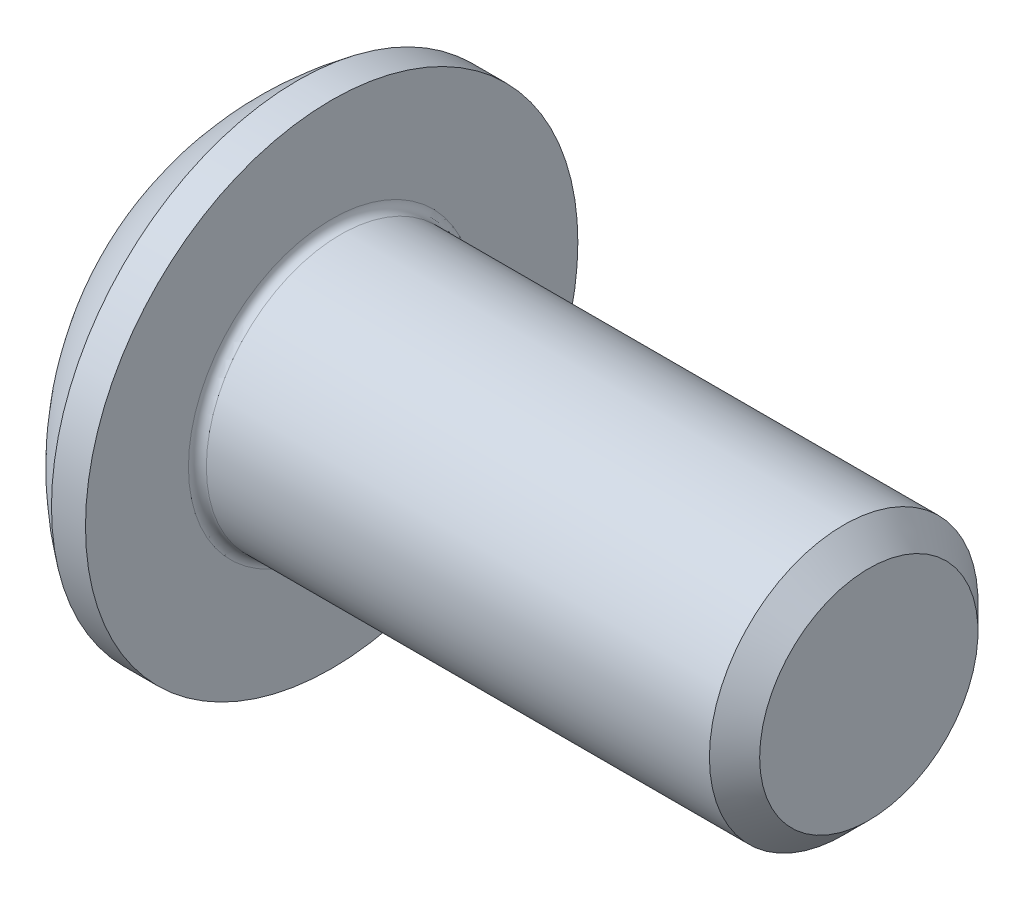
ISO-10303-21;
HEADER;
FILE_DESCRIPTION(('STEP AP214'),'2;1');
FILE_NAME('part.step','',(''),(''),'','','');
FILE_SCHEMA(('AUTOMOTIVE_DESIGN { 1 0 10303 214 1 1 1 1 }'));
ENDSEC;
DATA;
#1=APPLICATION_CONTEXT('core data for automotive mechanical design processes');
#2=APPLICATION_PROTOCOL_DEFINITION('international standard','automotive_design',2000,#1);
#3=PRODUCT_CONTEXT('',#1,'mechanical');
#4=PRODUCT('Part','Part','',(#3));
#5=PRODUCT_RELATED_PRODUCT_CATEGORY('part','',(#4));
#6=PRODUCT_DEFINITION_FORMATION('','',#4);
#7=PRODUCT_DEFINITION_CONTEXT('part definition',#1,'design');
#8=PRODUCT_DEFINITION('design','',#6,#7);
#9=PRODUCT_DEFINITION_SHAPE('','',#8);
#10=(LENGTH_UNIT() NAMED_UNIT(*) SI_UNIT(.MILLI.,.METRE.));
#11=(NAMED_UNIT(*) PLANE_ANGLE_UNIT() SI_UNIT($,.RADIAN.));
#12=(NAMED_UNIT(*) SI_UNIT($,.STERADIAN.) SOLID_ANGLE_UNIT());
#13=UNCERTAINTY_MEASURE_WITH_UNIT(LENGTH_MEASURE(1.E-05),#10,'distance_accuracy_value','');
#14=(GEOMETRIC_REPRESENTATION_CONTEXT(3) GLOBAL_UNCERTAINTY_ASSIGNED_CONTEXT((#13)) GLOBAL_UNIT_ASSIGNED_CONTEXT((#10,
#11,#12)) REPRESENTATION_CONTEXT('',''));
#15=CARTESIAN_POINT('',(0.,0.,0.));
#16=DIRECTION('',(0.,0.,1.));
#17=DIRECTION('',(1.,0.,0.));
#18=AXIS2_PLACEMENT_3D('',#15,#16,#17);
#19=CARTESIAN_POINT('',(0.,0.,0.));
#20=DIRECTION('',(-1.,0.,0.));
#21=DIRECTION('',(0.,0.,1.));
#22=AXIS2_PLACEMENT_3D('',#19,#20,#21);
#23=PLANE('',#22);
#24=CARTESIAN_POINT('',(0.,0.,0.));
#25=DIRECTION('',(-1.,0.,0.));
#26=DIRECTION('',(0.,0.,1.));
#27=AXIS2_PLACEMENT_3D('',#24,#25,#26);
#28=CIRCLE('',#27,1.375);
#29=CARTESIAN_POINT('',(0.,1.375,0.));
#30=VERTEX_POINT('',#29);
#31=EDGE_CURVE('E156',#30,#30,#28,.T.);
#32=ORIENTED_EDGE('',*,*,#31,.T.);
#33=EDGE_LOOP('',(#32));
#34=FACE_BOUND('',#33,.T.);
#35=DIRECTION('',(0.,-1.,0.));
#36=VECTOR('',#35,1.);
#37=CARTESIAN_POINT('',(0.,-0.577350269189625,0.999999999999998));
#38=LINE('',#37,#36);
#39=CARTESIAN_POINT('',(0.,0.577350269189628,1.));
#40=VERTEX_POINT('',#39);
#41=CARTESIAN_POINT('',(0.,-0.577350269189625,0.999999999999998));
#42=VERTEX_POINT('',#41);
#43=EDGE_CURVE('E51',#40,#42,#38,.T.);
#44=ORIENTED_EDGE('',*,*,#43,.T.);
#45=DIRECTION('',(0.,-0.499999999999999,-0.866025403784439));
#46=VECTOR('',#45,1.);
#47=CARTESIAN_POINT('',(0.,-1.15470053837925,0.));
#48=LINE('',#47,#46);
#49=CARTESIAN_POINT('',(0.,-1.15470053837925,0.));
#50=VERTEX_POINT('',#49);
#51=EDGE_CURVE('E276',#42,#50,#48,.T.);
#52=ORIENTED_EDGE('',*,*,#51,.T.);
#53=DIRECTION('',(0.,0.499999999999997,-0.86602540378444));
#54=VECTOR('',#53,1.);
#55=CARTESIAN_POINT('',(0.,-0.577350269189626,-1.));
#56=LINE('',#55,#54);
#57=CARTESIAN_POINT('',(0.,-0.577350269189626,-1.));
#58=VERTEX_POINT('',#57);
#59=EDGE_CURVE('E131',#50,#58,#56,.T.);
#60=ORIENTED_EDGE('',*,*,#59,.T.);
#61=DIRECTION('',(0.,1.,0.));
#62=VECTOR('',#61,1.);
#63=CARTESIAN_POINT('',(0.,0.577350269189628,-1.));
#64=LINE('',#63,#62);
#65=CARTESIAN_POINT('',(0.,0.577350269189628,-1.));
#66=VERTEX_POINT('',#65);
#67=EDGE_CURVE('E279',#58,#66,#64,.T.);
#68=ORIENTED_EDGE('',*,*,#67,.T.);
#69=DIRECTION('',(0.,0.499999999999998,0.866025403784439));
#70=VECTOR('',#69,1.);
#71=CARTESIAN_POINT('',(0.,1.15470053837925,0.));
#72=LINE('',#71,#70);
#73=CARTESIAN_POINT('',(0.,1.15470053837925,0.));
#74=VERTEX_POINT('',#73);
#75=EDGE_CURVE('E281',#66,#74,#72,.T.);
#76=ORIENTED_EDGE('',*,*,#75,.T.);
#77=DIRECTION('',(0.,-0.499999999999998,0.866025403784439));
#78=VECTOR('',#77,1.);
#79=CARTESIAN_POINT('',(0.,0.577350269189628,1.));
#80=LINE('',#79,#78);
#81=EDGE_CURVE('E283',#74,#40,#80,.T.);
#82=ORIENTED_EDGE('',*,*,#81,.T.);
#83=EDGE_LOOP('',(#44,#52,#60,#68,#76,#82));
#84=FACE_BOUND('',#83,.T.);
#85=ADVANCED_FACE('F36',(#34,#84),#23,.T.);
#86=CARTESIAN_POINT('',(3.09208705357143,0.,0.));
#87=DIRECTION('',(-1.,0.,0.));
#88=DIRECTION('',(0.,1.,0.));
#89=AXIS2_PLACEMENT_3D('',#86,#87,#88);
#90=SPHERICAL_SURFACE('',#89,3.38402531711334);
#91=CARTESIAN_POINT('',(1.12,0.,0.));
#92=DIRECTION('',(-1.,0.,0.));
#93=DIRECTION('',(0.,0.,1.));
#94=AXIS2_PLACEMENT_3D('',#91,#92,#93);
#95=CIRCLE('',#94,2.75);
#96=CARTESIAN_POINT('',(1.12,2.75,0.));
#97=VERTEX_POINT('',#96);
#98=EDGE_CURVE('E153',#97,#97,#95,.T.);
#99=CARTESIAN_POINT('',(1.12,2.75,0.));
#100=CARTESIAN_POINT('',(1.10481062387311,2.73910737441976,0.));
#101=CARTESIAN_POINT('',(1.08971151227306,2.72808887915979,0.));
#102=CARTESIAN_POINT('',(1.0596979238458,2.70580322842872,0.));
#103=CARTESIAN_POINT('',(1.04478344701859,2.69453607295762,0.));
#104=CARTESIAN_POINT('',(1.01514323385619,2.67175618095264,0.));
#105=CARTESIAN_POINT('',(1.00041749752099,2.66024344441875,0.));
#106=CARTESIAN_POINT('',(0.971158805656545,2.63697555515855,0.));
#107=CARTESIAN_POINT('',(0.956625850127299,2.62522040243224,0.));
#108=CARTESIAN_POINT('',(0.927756710897371,2.60147090731495,0.));
#109=CARTESIAN_POINT('',(0.913420527196688,2.58947656492397,0.));
#110=CARTESIAN_POINT('',(0.884948867644416,2.56525198399186,0.));
#111=CARTESIAN_POINT('',(0.870813391792827,2.55302174545073,0.));
#112=CARTESIAN_POINT('',(0.842747029113065,2.52832873014992,0.));
#113=CARTESIAN_POINT('',(0.828816142284894,2.51586595339023,0.));
#114=CARTESIAN_POINT('',(0.801162782583113,2.49071128352529,0.));
#115=CARTESIAN_POINT('',(0.787440309709504,2.47801939042003,0.));
#116=CARTESIAN_POINT('',(0.760207545643396,2.45240997261913,0.));
#117=CARTESIAN_POINT('',(0.746697254450898,2.43949244792351,0.));
#118=CARTESIAN_POINT('',(0.719892563210687,2.41343531365461,0.));
#119=CARTESIAN_POINT('',(0.706598163162974,2.40029570408135,0.));
#120=CARTESIAN_POINT('',(0.68022890440102,2.37379800774502,0.));
#121=CARTESIAN_POINT('',(0.667154045686777,2.36043992098195,0.));
#122=CARTESIAN_POINT('',(0.641227459501532,2.33350893794072,0.));
#123=CARTESIAN_POINT('',(0.628375732030529,2.31993604166255,0.));
#124=CARTESIAN_POINT('',(0.602898936977403,2.29257916624505,0.));
#125=CARTESIAN_POINT('',(0.59027386939528,2.27879518710571,0.));
#126=CARTESIAN_POINT('',(0.565253860532466,2.25101993057597,0.));
#127=CARTESIAN_POINT('',(0.552858919251774,2.23702865318557,0.));
#128=CARTESIAN_POINT('',(0.528302566219551,2.20884264168084,0.));
#129=CARTESIAN_POINT('',(0.51614115446802,2.19464790756651,0.));
#130=CARTESIAN_POINT('',(0.492055199602609,2.16605888000331,0.));
#131=CARTESIAN_POINT('',(0.480130656488731,2.15166458655444,0.));
#132=CARTESIAN_POINT('',(0.456521712971076,2.12268039250375,0.));
#133=CARTESIAN_POINT('',(0.444837312567301,2.10809049190193,0.));
#134=CARTESIAN_POINT('',(0.421711862607313,2.07871908943395,0.));
#135=CARTESIAN_POINT('',(0.410270813051102,2.06393758756779,0.));
#136=CARTESIAN_POINT('',(0.387635206107868,2.03418704106694,0.));
#137=CARTESIAN_POINT('',(0.376440648720846,2.01921799643224,0.));
#138=CARTESIAN_POINT('',(0.354301099759282,1.98909647438294,0.));
#139=CARTESIAN_POINT('',(0.343356108184739,1.97394399696834,0.));
#140=CARTESIAN_POINT('',(0.321718695969178,1.94345976971223,0.));
#141=CARTESIAN_POINT('',(0.311026275328161,1.92812801987073,0.));
#142=CARTESIAN_POINT('',(0.289896940753304,1.89728945733595,0.));
#143=CARTESIAN_POINT('',(0.279460026819464,1.88178264464266,0.));
#144=CARTESIAN_POINT('',(0.258844571279342,1.85059821404564,0.));
#145=CARTESIAN_POINT('',(0.248666029673059,1.8349205961419,0.));
#146=CARTESIAN_POINT('',(0.22857011346766,1.80339885966283,0.));
#147=CARTESIAN_POINT('',(0.218652738868544,1.78755474108751,0.));
#148=CARTESIAN_POINT('',(0.199081879651594,1.75570435351857,0.));
#149=CARTESIAN_POINT('',(0.18942839503376,1.73969808452497,0.));
#150=CARTESIAN_POINT('',(0.170387966290661,1.70752779089731,0.));
#151=CARTESIAN_POINT('',(0.161001022165396,1.69136376626327,0.));
#152=CARTESIAN_POINT('',(0.142496251764343,1.65888239943362,0.));
#153=CARTESIAN_POINT('',(0.133378425488555,1.64256505723801,0.));
#154=CARTESIAN_POINT('',(0.115414394146275,1.6097815355094,0.));
#155=CARTESIAN_POINT('',(0.106568189079783,1.59331535597639,0.));
#156=CARTESIAN_POINT('',(0.0891498293355242,1.56023868047805,0.));
#157=CARTESIAN_POINT('',(0.080577674657757,1.54362818451271,0.));
#158=CARTESIAN_POINT('',(0.0637097681419226,1.51026743736856,0.));
#159=CARTESIAN_POINT('',(0.0554140163038552,1.49351718618973,0.));
#160=CARTESIAN_POINT('',(0.0391011975643829,1.45988152563661,0.));
#161=CARTESIAN_POINT('',(0.0310841306629778,1.44299611626231,0.));
#162=CARTESIAN_POINT('',(0.0153308667129113,1.409094783048,0.));
#163=CARTESIAN_POINT('',(0.00759466966424984,1.39207885920799,0.));
#164=CARTESIAN_POINT('',(0.,1.375,0.));
#165=B_SPLINE_CURVE_WITH_KNOTS('',3,(#99,#100,#101,#102,#103,#104,#105,#106,#107,#108,#109,#110,
#111,#112,#113,#114,#115,#116,#117,#118,#119,#120,#121,#122,#123,#124,#125,#126,#127,#128,#129,
#130,#131,#132,#133,#134,#135,#136,#137,#138,#139,#140,#141,#142,#143,#144,#145,#146,#147,#148,
#149,#150,#151,#152,#153,#154,#155,#156,#157,#158,#159,#160,#161,#162,#163,#164),.UNSPECIFIED.,
.F.,.F.,(4,2,2,2,2,2,2,2,2,2,2,2,2,2,2,2,2,2,2,2,2,2,2,2,2,2,2,2,2,2,2,2,4),(0.,
0.0560733976663451,0.112146795332691,0.168220192999036,0.224293590665382,0.280366988331727,
0.336440385998073,0.392513783664418,0.448587181330764,0.504660578997109,0.560733976663455,
0.6168073743298,0.672880771996145,0.72895416966249,0.785027567328836,0.841100964995181,
0.897174362661527,0.953247760327872,1.00932115799422,1.06539455566056,1.12146795332691,
1.17754135099325,1.2336147486596,1.28968814632594,1.34576154399229,1.40183494165864,
1.45790833932498,1.51398173699133,1.57005513465767,1.62612853232402,1.68220192999036,
1.73827532765671,1.79434872532305),.UNSPECIFIED.);
#166=EDGE_CURVE('BSEAM177',#97,#30,#165,.T.);
#167=ORIENTED_EDGE('',*,*,#98,.T.);
#168=ORIENTED_EDGE('',*,*,#31,.F.);
#169=ORIENTED_EDGE('',*,*,#166,.T.);
#170=ORIENTED_EDGE('',*,*,#166,.F.);
#171=EDGE_LOOP('',(#167,#169,#168,#170));
#172=FACE_BOUND('',#171,.T.);
#173=ADVANCED_FACE('F177',(#172),#90,.T.);
#174=CARTESIAN_POINT('',(0.,0.,0.));
#175=DIRECTION('',(-1.,0.,0.));
#176=DIRECTION('',(0.,0.,1.));
#177=AXIS2_PLACEMENT_3D('',#174,#175,#176);
#178=CYLINDRICAL_SURFACE('',#177,2.75);
#179=ORIENTED_EDGE('',*,*,#98,.F.);
#180=EDGE_LOOP('',(#179));
#181=FACE_BOUND('',#180,.T.);
#182=CARTESIAN_POINT('',(1.5,0.,0.));
#183=DIRECTION('',(-1.,0.,0.));
#184=DIRECTION('',(0.,0.,1.));
#185=AXIS2_PLACEMENT_3D('',#182,#183,#184);
#186=CIRCLE('',#185,2.75);
#187=CARTESIAN_POINT('',(1.5,0.,2.75));
#188=VERTEX_POINT('',#187);
#189=EDGE_CURVE('E150',#188,#188,#186,.T.);
#190=ORIENTED_EDGE('',*,*,#189,.T.);
#191=EDGE_LOOP('',(#190));
#192=FACE_BOUND('',#191,.T.);
#193=ADVANCED_FACE('F182',(#181,#192),#178,.T.);
#194=CARTESIAN_POINT('',(1.5,1.5,0.));
#195=DIRECTION('',(-1.,0.,0.));
#196=DIRECTION('',(0.,0.,1.));
#197=AXIS2_PLACEMENT_3D('',#194,#195,#196);
#198=PLANE('',#197);
#199=CARTESIAN_POINT('',(1.5,0.,0.));
#200=DIRECTION('',(-1.,0.,0.));
#201=DIRECTION('',(0.,0.,1.));
#202=AXIS2_PLACEMENT_3D('',#199,#200,#201);
#203=CIRCLE('',#202,1.6);
#204=CARTESIAN_POINT('',(1.5,0.,1.6));
#205=VERTEX_POINT('',#204);
#206=EDGE_CURVE('E44',#205,#205,#203,.T.);
#207=ORIENTED_EDGE('',*,*,#206,.T.);
#208=EDGE_LOOP('',(#207));
#209=FACE_BOUND('',#208,.T.);
#210=ORIENTED_EDGE('',*,*,#189,.F.);
#211=EDGE_LOOP('',(#210));
#212=FACE_BOUND('',#211,.T.);
#213=ADVANCED_FACE('F161',(#209,#212),#198,.F.);
#214=CARTESIAN_POINT('',(0.,0.,0.));
#215=DIRECTION('',(-1.,0.,0.));
#216=DIRECTION('',(0.,0.,1.));
#217=AXIS2_PLACEMENT_3D('',#214,#215,#216);
#218=CYLINDRICAL_SURFACE('',#217,1.5);
#219=CARTESIAN_POINT('',(1.6,0.,0.));
#220=DIRECTION('',(-1.,0.,0.));
#221=DIRECTION('',(0.,0.,1.));
#222=AXIS2_PLACEMENT_3D('',#219,#220,#221);
#223=CIRCLE('',#222,1.5);
#224=CARTESIAN_POINT('',(1.6,0.,1.5));
#225=VERTEX_POINT('',#224);
#226=EDGE_CURVE('E11',#225,#225,#223,.F.);
#227=ORIENTED_EDGE('',*,*,#226,.T.);
#228=EDGE_LOOP('',(#227));
#229=FACE_BOUND('',#228,.T.);
#230=CARTESIAN_POINT('',(7.2195,0.,0.));
#231=DIRECTION('',(-1.,0.,0.));
#232=DIRECTION('',(0.,0.,1.));
#233=AXIS2_PLACEMENT_3D('',#230,#231,#232);
#234=CIRCLE('',#233,1.5);
#235=CARTESIAN_POINT('',(7.2195,0.,1.5));
#236=VERTEX_POINT('',#235);
#237=EDGE_CURVE('E147',#236,#236,#234,.T.);
#238=ORIENTED_EDGE('',*,*,#237,.T.);
#239=EDGE_LOOP('',(#238));
#240=FACE_BOUND('',#239,.T.);
#241=ADVANCED_FACE('F191',(#229,#240),#218,.T.);
#242=CARTESIAN_POINT('',(7.5,0.,0.));
#243=DIRECTION('',(-1.,0.,0.));
#244=DIRECTION('',(0.,0.,1.));
#245=AXIS2_PLACEMENT_3D('',#242,#243,#244);
#246=CONICAL_SURFACE('',#245,1.2195,0.785398163397446);
#247=ORIENTED_EDGE('',*,*,#237,.F.);
#248=EDGE_LOOP('',(#247));
#249=FACE_BOUND('',#248,.T.);
#250=CARTESIAN_POINT('',(7.5,0.,0.));
#251=DIRECTION('',(-1.,0.,0.));
#252=DIRECTION('',(0.,0.,1.));
#253=AXIS2_PLACEMENT_3D('',#250,#251,#252);
#254=CIRCLE('',#253,1.2195);
#255=CARTESIAN_POINT('',(7.5,0.,1.2195));
#256=VERTEX_POINT('',#255);
#257=EDGE_CURVE('E143',#256,#256,#254,.T.);
#258=ORIENTED_EDGE('',*,*,#257,.T.);
#259=EDGE_LOOP('',(#258));
#260=FACE_BOUND('',#259,.T.);
#261=ADVANCED_FACE('F172',(#249,#260),#246,.T.);
#262=CARTESIAN_POINT('',(7.5,0.,0.));
#263=DIRECTION('',(-1.,0.,0.));
#264=DIRECTION('',(0.,0.,1.));
#265=AXIS2_PLACEMENT_3D('',#262,#263,#264);
#266=PLANE('',#265);
#267=ORIENTED_EDGE('',*,*,#257,.F.);
#268=EDGE_LOOP('',(#267));
#269=FACE_BOUND('',#268,.T.);
#270=ADVANCED_FACE('F165',(#269),#266,.F.);
#271=CARTESIAN_POINT('',(1.6,0.,0.));
#272=DIRECTION('',(-1.,0.,0.));
#273=DIRECTION('',(0.,0.,1.));
#274=AXIS2_PLACEMENT_3D('',#271,#272,#273);
#275=TOROIDAL_SURFACE('',#274,1.6,0.1);
#276=ORIENTED_EDGE('',*,*,#226,.F.);
#277=EDGE_LOOP('',(#276));
#278=FACE_BOUND('',#277,.T.);
#279=ORIENTED_EDGE('',*,*,#206,.F.);
#280=EDGE_LOOP('',(#279));
#281=FACE_BOUND('',#280,.T.);
#282=ADVANCED_FACE('F38',(#278,#281),#275,.F.);
#283=CARTESIAN_POINT('',(1.04,-1.15470053837925,0.));
#284=DIRECTION('',(0.,0.866025403784439,-0.499999999999999));
#285=DIRECTION('',(0.,0.499999999999999,0.866025403784439));
#286=AXIS2_PLACEMENT_3D('',#283,#284,#285);
#287=PLANE('',#286);
#288=DIRECTION('',(0.,-0.499999999999999,-0.866025403784439));
#289=VECTOR('',#288,1.);
#290=CARTESIAN_POINT('',(1.04,-1.15470053837925,0.));
#291=LINE('',#290,#289);
#292=CARTESIAN_POINT('',(1.04,-0.577350269189625,0.999999999999998));
#293=VERTEX_POINT('',#292);
#294=CARTESIAN_POINT('',(1.04,-0.866025403784437,0.499999999999998));
#295=VERTEX_POINT('',#294);
#296=EDGE_CURVE('E117',#293,#295,#291,.T.);
#297=ORIENTED_EDGE('',*,*,#296,.T.);
#298=CARTESIAN_POINT('',(1.04,-1.15470053837925,0.));
#299=VERTEX_POINT('',#298);
#300=EDGE_CURVE('E112',#295,#299,#291,.T.);
#301=ORIENTED_EDGE('',*,*,#300,.T.);
#302=DIRECTION('',(-1.,0.,0.));
#303=VECTOR('',#302,1.);
#304=CARTESIAN_POINT('',(1.04,-1.15470053837925,0.));
#305=LINE('',#304,#303);
#306=EDGE_CURVE('E114',#299,#50,#305,.T.);
#307=ORIENTED_EDGE('',*,*,#306,.T.);
#308=ORIENTED_EDGE('',*,*,#51,.F.);
#309=DIRECTION('',(-1.,0.,0.));
#310=VECTOR('',#309,1.);
#311=CARTESIAN_POINT('',(1.04,-0.577350269189625,0.999999999999998));
#312=LINE('',#311,#310);
#313=EDGE_CURVE('E272',#293,#42,#312,.T.);
#314=ORIENTED_EDGE('',*,*,#313,.F.);
#315=EDGE_LOOP('',(#297,#301,#307,#308,#314));
#316=FACE_BOUND('',#315,.T.);
#317=ADVANCED_FACE('F113',(#316),#287,.T.);
#318=CARTESIAN_POINT('',(1.04,-0.577350269189626,-1.));
#319=DIRECTION('',(0.,0.86602540378444,0.499999999999998));
#320=DIRECTION('',(0.,-0.499999999999998,0.86602540378444));
#321=AXIS2_PLACEMENT_3D('',#318,#319,#320);
#322=PLANE('',#321);
#323=DIRECTION('',(0.,0.499999999999997,-0.86602540378444));
#324=VECTOR('',#323,1.);
#325=CARTESIAN_POINT('',(1.04,-0.577350269189626,-1.));
#326=LINE('',#325,#324);
#327=CARTESIAN_POINT('',(1.04,-0.86602540378444,-0.499999999999997));
#328=VERTEX_POINT('',#327);
#329=EDGE_CURVE('E59',#299,#328,#326,.T.);
#330=ORIENTED_EDGE('',*,*,#329,.T.);
#331=CARTESIAN_POINT('',(1.04,-0.577350269189626,-1.));
#332=VERTEX_POINT('',#331);
#333=EDGE_CURVE('E126',#328,#332,#326,.T.);
#334=ORIENTED_EDGE('',*,*,#333,.T.);
#335=DIRECTION('',(-1.,0.,0.));
#336=VECTOR('',#335,1.);
#337=CARTESIAN_POINT('',(1.04,-0.577350269189626,-1.));
#338=LINE('',#337,#336);
#339=EDGE_CURVE('E133',#332,#58,#338,.T.);
#340=ORIENTED_EDGE('',*,*,#339,.T.);
#341=ORIENTED_EDGE('',*,*,#59,.F.);
#342=ORIENTED_EDGE('',*,*,#306,.F.);
#343=EDGE_LOOP('',(#330,#334,#340,#341,#342));
#344=FACE_BOUND('',#343,.T.);
#345=ADVANCED_FACE('F129',(#344),#322,.T.);
#346=CARTESIAN_POINT('',(1.04,0.577350269189628,-1.));
#347=DIRECTION('',(0.,0.,1.));
#348=DIRECTION('',(0.,-1.,0.));
#349=AXIS2_PLACEMENT_3D('',#346,#347,#348);
#350=PLANE('',#349);
#351=DIRECTION('',(0.,1.,0.));
#352=VECTOR('',#351,1.);
#353=CARTESIAN_POINT('',(1.04,0.577350269189628,-1.));
#354=LINE('',#353,#352);
#355=CARTESIAN_POINT('',(1.04,0.,-1.));
#356=VERTEX_POINT('',#355);
#357=EDGE_CURVE('E253',#332,#356,#354,.T.);
#358=ORIENTED_EDGE('',*,*,#357,.T.);
#359=CARTESIAN_POINT('',(1.04,0.577350269189628,-1.));
#360=VERTEX_POINT('',#359);
#361=EDGE_CURVE('E125',#356,#360,#354,.T.);
#362=ORIENTED_EDGE('',*,*,#361,.T.);
#363=DIRECTION('',(-1.,0.,0.));
#364=VECTOR('',#363,1.);
#365=CARTESIAN_POINT('',(1.04,0.577350269189628,-1.));
#366=LINE('',#365,#364);
#367=EDGE_CURVE('E138',#360,#66,#366,.T.);
#368=ORIENTED_EDGE('',*,*,#367,.T.);
#369=ORIENTED_EDGE('',*,*,#67,.F.);
#370=ORIENTED_EDGE('',*,*,#339,.F.);
#371=EDGE_LOOP('',(#358,#362,#368,#369,#370));
#372=FACE_BOUND('',#371,.T.);
#373=ADVANCED_FACE('F205',(#372),#350,.T.);
#374=CARTESIAN_POINT('',(1.04,1.15470053837925,0.));
#375=DIRECTION('',(0.,-0.86602540378444,0.499999999999998));
#376=DIRECTION('',(0.,-0.499999999999998,-0.86602540378444));
#377=AXIS2_PLACEMENT_3D('',#374,#375,#376);
#378=PLANE('',#377);
#379=DIRECTION('',(0.,0.499999999999998,0.866025403784439));
#380=VECTOR('',#379,1.);
#381=CARTESIAN_POINT('',(1.04,1.15470053837925,0.));
#382=LINE('',#381,#380);
#383=CARTESIAN_POINT('',(1.04,0.86602540378444,-0.499999999999999));
#384=VERTEX_POINT('',#383);
#385=EDGE_CURVE('E242',#360,#384,#382,.T.);
#386=ORIENTED_EDGE('',*,*,#385,.T.);
#387=CARTESIAN_POINT('',(1.04,1.15470053837925,0.));
#388=VERTEX_POINT('',#387);
#389=EDGE_CURVE('E247',#384,#388,#382,.T.);
#390=ORIENTED_EDGE('',*,*,#389,.T.);
#391=DIRECTION('',(-1.,0.,0.));
#392=VECTOR('',#391,1.);
#393=CARTESIAN_POINT('',(1.04,1.15470053837925,0.));
#394=LINE('',#393,#392);
#395=EDGE_CURVE('E287',#388,#74,#394,.T.);
#396=ORIENTED_EDGE('',*,*,#395,.T.);
#397=ORIENTED_EDGE('',*,*,#75,.F.);
#398=ORIENTED_EDGE('',*,*,#367,.F.);
#399=EDGE_LOOP('',(#386,#390,#396,#397,#398));
#400=FACE_BOUND('',#399,.T.);
#401=ADVANCED_FACE('F208',(#400),#378,.T.);
#402=CARTESIAN_POINT('',(1.04,0.577350269189628,1.));
#403=DIRECTION('',(0.,-0.86602540378444,-0.499999999999998));
#404=DIRECTION('',(0.,0.499999999999998,-0.86602540378444));
#405=AXIS2_PLACEMENT_3D('',#402,#403,#404);
#406=PLANE('',#405);
#407=DIRECTION('',(0.,-0.499999999999998,0.866025403784439));
#408=VECTOR('',#407,1.);
#409=CARTESIAN_POINT('',(1.04,0.577350269189628,1.));
#410=LINE('',#409,#408);
#411=CARTESIAN_POINT('',(1.04,0.86602540378444,0.499999999999999));
#412=VERTEX_POINT('',#411);
#413=EDGE_CURVE('E250',#388,#412,#410,.T.);
#414=ORIENTED_EDGE('',*,*,#413,.T.);
#415=CARTESIAN_POINT('',(1.04,0.577350269189628,1.));
#416=VERTEX_POINT('',#415);
#417=EDGE_CURVE('E258',#412,#416,#410,.T.);
#418=ORIENTED_EDGE('',*,*,#417,.T.);
#419=DIRECTION('',(-1.,0.,0.));
#420=VECTOR('',#419,1.);
#421=CARTESIAN_POINT('',(1.04,0.577350269189628,1.));
#422=LINE('',#421,#420);
#423=EDGE_CURVE('E271',#416,#40,#422,.T.);
#424=ORIENTED_EDGE('',*,*,#423,.T.);
#425=ORIENTED_EDGE('',*,*,#81,.F.);
#426=ORIENTED_EDGE('',*,*,#395,.F.);
#427=EDGE_LOOP('',(#414,#418,#424,#425,#426));
#428=FACE_BOUND('',#427,.T.);
#429=ADVANCED_FACE('F212',(#428),#406,.T.);
#430=CARTESIAN_POINT('',(1.04,-0.577350269189625,0.999999999999998));
#431=DIRECTION('',(0.,0.,-1.));
#432=DIRECTION('',(0.,1.,0.));
#433=AXIS2_PLACEMENT_3D('',#430,#431,#432);
#434=PLANE('',#433);
#435=DIRECTION('',(0.,-1.,0.));
#436=VECTOR('',#435,1.);
#437=CARTESIAN_POINT('',(1.04,-0.577350269189625,0.999999999999998));
#438=LINE('',#437,#436);
#439=CARTESIAN_POINT('',(1.04,0.,1.));
#440=VERTEX_POINT('',#439);
#441=EDGE_CURVE('E264',#416,#440,#438,.T.);
#442=ORIENTED_EDGE('',*,*,#441,.T.);
#443=EDGE_CURVE('E266',#440,#293,#438,.T.);
#444=ORIENTED_EDGE('',*,*,#443,.T.);
#445=ORIENTED_EDGE('',*,*,#313,.T.);
#446=ORIENTED_EDGE('',*,*,#43,.F.);
#447=ORIENTED_EDGE('',*,*,#423,.F.);
#448=EDGE_LOOP('',(#442,#444,#445,#446,#447));
#449=FACE_BOUND('',#448,.T.);
#450=ADVANCED_FACE('F216',(#449),#434,.T.);
#451=CARTESIAN_POINT('',(1.04,-1.73205080756887,-0.999999999999999));
#452=DIRECTION('',(1.,0.,0.));
#453=DIRECTION('',(0.,0.,-1.));
#454=AXIS2_PLACEMENT_3D('',#451,#452,#453);
#455=PLANE('',#454);
#456=CARTESIAN_POINT('',(1.04,0.,0.));
#457=DIRECTION('',(-1.,0.,0.));
#458=DIRECTION('',(0.,0.,1.));
#459=AXIS2_PLACEMENT_3D('',#456,#457,#458);
#460=CIRCLE('',#459,1.);
#461=EDGE_CURVE('E239',#384,#356,#460,.T.);
#462=ORIENTED_EDGE('',*,*,#461,.F.);
#463=ORIENTED_EDGE('',*,*,#385,.F.);
#464=ORIENTED_EDGE('',*,*,#361,.F.);
#465=EDGE_LOOP('',(#462,#463,#464));
#466=FACE_BOUND('',#465,.T.);
#467=ADVANCED_FACE('F220',(#466),#455,.F.);
#468=EDGE_CURVE('E144',#412,#384,#460,.T.);
#469=ORIENTED_EDGE('',*,*,#468,.F.);
#470=ORIENTED_EDGE('',*,*,#413,.F.);
#471=ORIENTED_EDGE('',*,*,#389,.F.);
#472=EDGE_LOOP('',(#469,#470,#471));
#473=FACE_BOUND('',#472,.T.);
#474=ADVANCED_FACE('F229',(#473),#455,.F.);
#475=EDGE_CURVE('E137',#440,#412,#460,.T.);
#476=ORIENTED_EDGE('',*,*,#475,.F.);
#477=ORIENTED_EDGE('',*,*,#441,.F.);
#478=ORIENTED_EDGE('',*,*,#417,.F.);
#479=EDGE_LOOP('',(#476,#477,#478));
#480=FACE_BOUND('',#479,.T.);
#481=ADVANCED_FACE('F234',(#480),#455,.F.);
#482=EDGE_CURVE('E132',#295,#440,#460,.T.);
#483=ORIENTED_EDGE('',*,*,#482,.F.);
#484=ORIENTED_EDGE('',*,*,#296,.F.);
#485=ORIENTED_EDGE('',*,*,#443,.F.);
#486=EDGE_LOOP('',(#483,#484,#485));
#487=FACE_BOUND('',#486,.T.);
#488=ADVANCED_FACE('F227',(#487),#455,.F.);
#489=EDGE_CURVE('E123',#328,#295,#460,.T.);
#490=ORIENTED_EDGE('',*,*,#489,.F.);
#491=ORIENTED_EDGE('',*,*,#329,.F.);
#492=ORIENTED_EDGE('',*,*,#300,.F.);
#493=EDGE_LOOP('',(#490,#491,#492));
#494=FACE_BOUND('',#493,.T.);
#495=ADVANCED_FACE('F122',(#494),#455,.F.);
#496=EDGE_CURVE('E245',#356,#328,#460,.T.);
#497=ORIENTED_EDGE('',*,*,#496,.F.);
#498=ORIENTED_EDGE('',*,*,#357,.F.);
#499=ORIENTED_EDGE('',*,*,#333,.F.);
#500=EDGE_LOOP('',(#497,#498,#499));
#501=FACE_BOUND('',#500,.T.);
#502=ADVANCED_FACE('F200',(#501),#455,.F.);
#503=CARTESIAN_POINT('',(1.61735026918963,0.,0.));
#504=DIRECTION('',(-1.,0.,0.));
#505=DIRECTION('',(0.,0.,1.));
#506=AXIS2_PLACEMENT_3D('',#503,#504,#505);
#507=CONICAL_SURFACE('',#506,0.,1.04719755119659);
#508=ORIENTED_EDGE('',*,*,#475,.T.);
#509=ORIENTED_EDGE('',*,*,#468,.T.);
#510=ORIENTED_EDGE('',*,*,#461,.T.);
#511=ORIENTED_EDGE('',*,*,#496,.T.);
#512=ORIENTED_EDGE('',*,*,#489,.T.);
#513=ORIENTED_EDGE('',*,*,#482,.T.);
#514=EDGE_LOOP('',(#508,#509,#510,#511,#512,#513));
#515=FACE_BOUND('',#514,.T.);
#516=CARTESIAN_POINT('',(1.61735026918963,0.,0.));
#517=VERTEX_POINT('',#516);
#518=VERTEX_LOOP('',#517);
#519=FACE_BOUND('',#518,.T.);
#520=ADVANCED_FACE('F198',(#515,#519),#507,.F.);
#521=CLOSED_SHELL('',(#85,#173,#193,#213,#241,#261,#270,#282,#317,#345,#373,#401,#429,#450,#467,
#474,#481,#488,#495,#502,#520));
#522=MANIFOLD_SOLID_BREP('B2',#521);
#523=ADVANCED_BREP_SHAPE_REPRESENTATION('',(#18,#522),#14);
#524=SHAPE_DEFINITION_REPRESENTATION(#9,#523);
ENDSEC;
END-ISO-10303-21;
